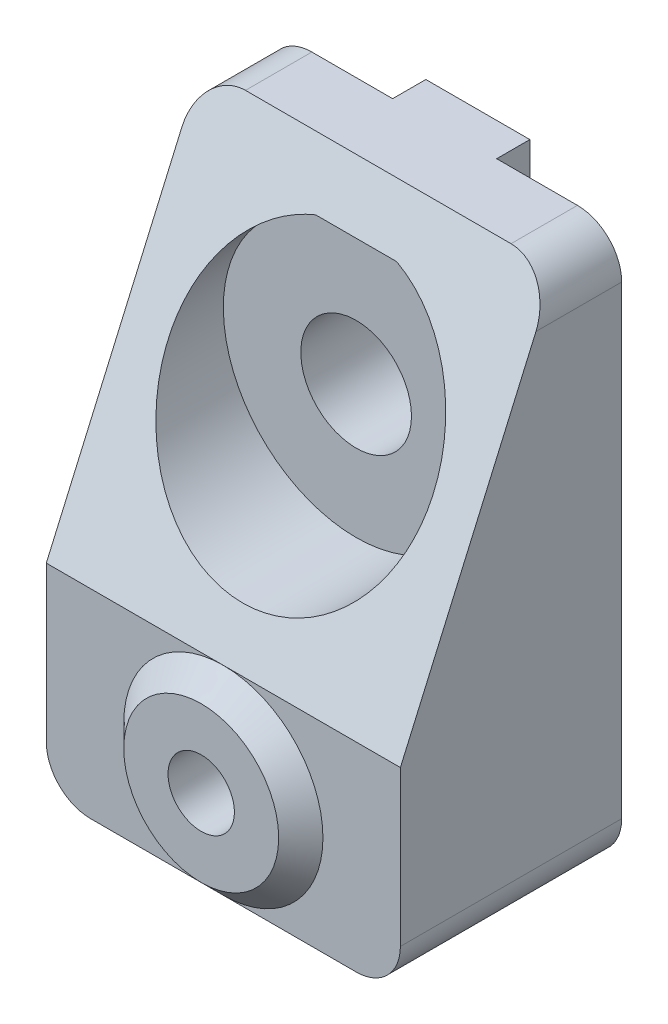
ISO-10303-21;
HEADER;
FILE_DESCRIPTION(('STEP AP214'),'2;1');
FILE_NAME('part.step','',(''),(''),'','','');
FILE_SCHEMA(('AUTOMOTIVE_DESIGN { 1 0 10303 214 1 1 1 1 }'));
ENDSEC;
DATA;
#1=APPLICATION_CONTEXT('core data for automotive mechanical design processes');
#2=APPLICATION_PROTOCOL_DEFINITION('international standard','automotive_design',2000,#1);
#3=PRODUCT_CONTEXT('',#1,'mechanical');
#4=PRODUCT('Part','Part','',(#3));
#5=PRODUCT_RELATED_PRODUCT_CATEGORY('part','',(#4));
#6=PRODUCT_DEFINITION_FORMATION('','',#4);
#7=PRODUCT_DEFINITION_CONTEXT('part definition',#1,'design');
#8=PRODUCT_DEFINITION('design','',#6,#7);
#9=PRODUCT_DEFINITION_SHAPE('','',#8);
#10=(LENGTH_UNIT() NAMED_UNIT(*) SI_UNIT(.MILLI.,.METRE.));
#11=(NAMED_UNIT(*) PLANE_ANGLE_UNIT() SI_UNIT($,.RADIAN.));
#12=(NAMED_UNIT(*) SI_UNIT($,.STERADIAN.) SOLID_ANGLE_UNIT());
#13=UNCERTAINTY_MEASURE_WITH_UNIT(LENGTH_MEASURE(1.E-05),#10,'distance_accuracy_value','');
#14=(GEOMETRIC_REPRESENTATION_CONTEXT(3) GLOBAL_UNCERTAINTY_ASSIGNED_CONTEXT((#13)) GLOBAL_UNIT_ASSIGNED_CONTEXT((#10,
#11,#12)) REPRESENTATION_CONTEXT('',''));
#15=CARTESIAN_POINT('',(0.,0.,0.));
#16=DIRECTION('',(0.,0.,1.));
#17=DIRECTION('',(1.,0.,0.));
#18=AXIS2_PLACEMENT_3D('',#15,#16,#17);
#19=CARTESIAN_POINT('',(-8.,-17.,10.));
#20=DIRECTION('',(0.,0.,1.));
#21=DIRECTION('',(1.,0.,0.));
#22=AXIS2_PLACEMENT_3D('',#19,#20,#21);
#23=PLANE('',#22);
#24=DIRECTION('',(-1.,0.,0.));
#25=VECTOR('',#24,1.);
#26=CARTESIAN_POINT('',(8.00000000000001,-8.,10.));
#27=LINE('',#26,#25);
#28=CARTESIAN_POINT('',(0.,-8.,10.));
#29=VERTEX_POINT('',#28);
#30=CARTESIAN_POINT('',(-8.,-8.,10.));
#31=VERTEX_POINT('',#30);
#32=EDGE_CURVE('E190',#29,#31,#27,.T.);
#33=ORIENTED_EDGE('',*,*,#32,.T.);
#34=DIRECTION('',(0.,1.,0.));
#35=VECTOR('',#34,1.);
#36=CARTESIAN_POINT('',(-8.,-17.,10.));
#37=LINE('',#36,#35);
#38=CARTESIAN_POINT('',(-8.,-15.,10.));
#39=VERTEX_POINT('',#38);
#40=EDGE_CURVE('E214',#39,#31,#37,.T.);
#41=ORIENTED_EDGE('',*,*,#40,.F.);
#42=CARTESIAN_POINT('',(-6.,-15.,10.));
#43=DIRECTION('',(0.,0.,1.));
#44=DIRECTION('',(1.,0.,0.));
#45=AXIS2_PLACEMENT_3D('',#42,#43,#44);
#46=CIRCLE('',#45,2.);
#47=CARTESIAN_POINT('',(-6.,-17.,10.));
#48=VERTEX_POINT('',#47);
#49=EDGE_CURVE('E249',#39,#48,#46,.T.);
#50=ORIENTED_EDGE('',*,*,#49,.T.);
#51=DIRECTION('',(1.,0.,0.));
#52=VECTOR('',#51,1.);
#53=CARTESIAN_POINT('',(-8.,-17.,10.));
#54=LINE('',#53,#52);
#55=CARTESIAN_POINT('',(0.,-17.,10.));
#56=VERTEX_POINT('',#55);
#57=EDGE_CURVE('E282',#48,#56,#54,.T.);
#58=ORIENTED_EDGE('',*,*,#57,.T.);
#59=CARTESIAN_POINT('',(0.,-12.5,10.));
#60=DIRECTION('',(0.,0.,1.));
#61=DIRECTION('',(1.,0.,0.));
#62=AXIS2_PLACEMENT_3D('',#59,#60,#61);
#63=CIRCLE('',#62,4.5);
#64=EDGE_CURVE('E370',#29,#56,#63,.T.);
#65=ORIENTED_EDGE('',*,*,#64,.F.);
#66=EDGE_LOOP('',(#33,#41,#50,#58,#65));
#67=FACE_BOUND('',#66,.T.);
#68=ADVANCED_FACE('F32',(#67),#23,.T.);
#69=CARTESIAN_POINT('',(8.00000000000001,-8.,10.));
#70=VERTEX_POINT('',#69);
#71=EDGE_CURVE('E184',#70,#29,#27,.T.);
#72=ORIENTED_EDGE('',*,*,#71,.T.);
#73=EDGE_CURVE('E373',#56,#29,#63,.T.);
#74=ORIENTED_EDGE('',*,*,#73,.F.);
#75=CARTESIAN_POINT('',(6.,-17.,10.));
#76=VERTEX_POINT('',#75);
#77=EDGE_CURVE('E287',#56,#76,#54,.T.);
#78=ORIENTED_EDGE('',*,*,#77,.T.);
#79=CARTESIAN_POINT('',(6.,-15.,10.));
#80=DIRECTION('',(0.,0.,1.));
#81=DIRECTION('',(1.,0.,0.));
#82=AXIS2_PLACEMENT_3D('',#79,#80,#81);
#83=CIRCLE('',#82,2.);
#84=CARTESIAN_POINT('',(8.,-15.,10.));
#85=VERTEX_POINT('',#84);
#86=EDGE_CURVE('E212',#76,#85,#83,.T.);
#87=ORIENTED_EDGE('',*,*,#86,.T.);
#88=DIRECTION('',(0.,1.,0.));
#89=VECTOR('',#88,1.);
#90=CARTESIAN_POINT('',(8.,-17.,10.));
#91=LINE('',#90,#89);
#92=EDGE_CURVE('E202',#85,#70,#91,.T.);
#93=ORIENTED_EDGE('',*,*,#92,.T.);
#94=EDGE_LOOP('',(#72,#74,#78,#87,#93));
#95=FACE_BOUND('',#94,.T.);
#96=ADVANCED_FACE('F209',(#95),#23,.T.);
#97=CARTESIAN_POINT('',(0.,0.,-1.5));
#98=DIRECTION('',(0.,0.,1.));
#99=DIRECTION('',(1.,0.,0.));
#100=AXIS2_PLACEMENT_3D('',#97,#98,#99);
#101=CYLINDRICAL_SURFACE('',#100,2.5);
#102=CARTESIAN_POINT('',(0.,0.,0.));
#103=DIRECTION('',(0.,0.,-1.));
#104=DIRECTION('',(-1.,0.,0.));
#105=AXIS2_PLACEMENT_3D('',#102,#103,#104);
#106=CIRCLE('',#105,2.5);
#107=CARTESIAN_POINT('',(-1.5,-2.,0.));
#108=VERTEX_POINT('',#107);
#109=CARTESIAN_POINT('',(-1.5,2.,0.));
#110=VERTEX_POINT('',#109);
#111=EDGE_CURVE('E229',#108,#110,#106,.T.);
#112=ORIENTED_EDGE('',*,*,#111,.T.);
#113=DIRECTION('',(0.,0.,1.));
#114=VECTOR('',#113,1.);
#115=CARTESIAN_POINT('',(-1.5,2.,-1.5));
#116=LINE('',#115,#114);
#117=CARTESIAN_POINT('',(-1.5,2.,-1.5));
#118=VERTEX_POINT('',#117);
#119=EDGE_CURVE('E408',#110,#118,#116,.F.);
#120=ORIENTED_EDGE('',*,*,#119,.T.);
#121=CARTESIAN_POINT('',(0.,0.,-1.5));
#122=DIRECTION('',(0.,0.,1.));
#123=DIRECTION('',(1.,0.,0.));
#124=AXIS2_PLACEMENT_3D('',#121,#122,#123);
#125=CIRCLE('',#124,2.5);
#126=CARTESIAN_POINT('',(1.5,2.,-1.5));
#127=VERTEX_POINT('',#126);
#128=EDGE_CURVE('E413',#127,#118,#125,.T.);
#129=ORIENTED_EDGE('',*,*,#128,.F.);
#130=DIRECTION('',(0.,0.,1.));
#131=VECTOR('',#130,1.);
#132=CARTESIAN_POINT('',(1.5,2.,-1.5));
#133=LINE('',#132,#131);
#134=CARTESIAN_POINT('',(1.5,2.,0.));
#135=VERTEX_POINT('',#134);
#136=EDGE_CURVE('E405',#127,#135,#133,.T.);
#137=ORIENTED_EDGE('',*,*,#136,.T.);
#138=CARTESIAN_POINT('',(0.,0.,0.));
#139=DIRECTION('',(0.,0.,-1.));
#140=DIRECTION('',(-1.,0.,0.));
#141=AXIS2_PLACEMENT_3D('',#138,#139,#140);
#142=CIRCLE('',#141,2.5);
#143=CARTESIAN_POINT('',(1.5,-2.,0.));
#144=VERTEX_POINT('',#143);
#145=EDGE_CURVE('E416',#135,#144,#142,.T.);
#146=ORIENTED_EDGE('',*,*,#145,.T.);
#147=DIRECTION('',(0.,0.,1.));
#148=VECTOR('',#147,1.);
#149=CARTESIAN_POINT('',(1.5,-2.,-1.5));
#150=LINE('',#149,#148);
#151=CARTESIAN_POINT('',(1.5,-2.,-1.5));
#152=VERTEX_POINT('',#151);
#153=EDGE_CURVE('E400',#144,#152,#150,.F.);
#154=ORIENTED_EDGE('',*,*,#153,.T.);
#155=CARTESIAN_POINT('',(-1.5,-2.,-1.5));
#156=VERTEX_POINT('',#155);
#157=EDGE_CURVE('E236',#156,#152,#125,.T.);
#158=ORIENTED_EDGE('',*,*,#157,.F.);
#159=DIRECTION('',(0.,0.,1.));
#160=VECTOR('',#159,1.);
#161=CARTESIAN_POINT('',(-1.5,-2.,-1.5));
#162=LINE('',#161,#160);
#163=EDGE_CURVE('E397',#156,#108,#162,.T.);
#164=ORIENTED_EDGE('',*,*,#163,.T.);
#165=EDGE_LOOP('',(#112,#120,#129,#137,#146,#154,#158,#164));
#166=FACE_BOUND('',#165,.T.);
#167=CARTESIAN_POINT('',(0.,0.,4.));
#168=DIRECTION('',(0.,0.,1.));
#169=DIRECTION('',(1.,0.,0.));
#170=AXIS2_PLACEMENT_3D('',#167,#168,#169);
#171=CIRCLE('',#170,2.5);
#172=CARTESIAN_POINT('',(2.5,0.,4.));
#173=VERTEX_POINT('',#172);
#174=EDGE_CURVE('E233',#173,#173,#171,.F.);
#175=ORIENTED_EDGE('',*,*,#174,.F.);
#176=EDGE_LOOP('',(#175));
#177=FACE_BOUND('',#176,.T.);
#178=ADVANCED_FACE('F452',(#166,#177),#101,.F.);
#179=CARTESIAN_POINT('',(-2.35,-17.,-1.5));
#180=DIRECTION('',(-1.,0.,0.));
#181=DIRECTION('',(0.,0.,1.));
#182=AXIS2_PLACEMENT_3D('',#179,#180,#181);
#183=PLANE('',#182);
#184=DIRECTION('',(0.,0.,1.));
#185=VECTOR('',#184,1.);
#186=CARTESIAN_POINT('',(-2.35,-2.,-1.5));
#187=LINE('',#186,#185);
#188=CARTESIAN_POINT('',(-2.35,-2.,-1.5));
#189=VERTEX_POINT('',#188);
#190=CARTESIAN_POINT('',(-2.35,-2.,0.));
#191=VERTEX_POINT('',#190);
#192=EDGE_CURVE('E379',#189,#191,#187,.T.);
#193=ORIENTED_EDGE('',*,*,#192,.F.);
#194=DIRECTION('',(0.,1.,0.));
#195=VECTOR('',#194,1.);
#196=CARTESIAN_POINT('',(-2.35,-17.,-1.5));
#197=LINE('',#196,#195);
#198=CARTESIAN_POINT('',(-2.35,-17.,-1.5));
#199=VERTEX_POINT('',#198);
#200=EDGE_CURVE('E232',#199,#189,#197,.T.);
#201=ORIENTED_EDGE('',*,*,#200,.F.);
#202=DIRECTION('',(0.,0.,1.));
#203=VECTOR('',#202,1.);
#204=CARTESIAN_POINT('',(-2.35,-17.,-1.5));
#205=LINE('',#204,#203);
#206=CARTESIAN_POINT('',(-2.35,-17.,0.));
#207=VERTEX_POINT('',#206);
#208=EDGE_CURVE('E331',#199,#207,#205,.T.);
#209=ORIENTED_EDGE('',*,*,#208,.T.);
#210=DIRECTION('',(0.,1.,0.));
#211=VECTOR('',#210,1.);
#212=CARTESIAN_POINT('',(-2.35,-17.,0.));
#213=LINE('',#212,#211);
#214=EDGE_CURVE('E225',#207,#191,#213,.T.);
#215=ORIENTED_EDGE('',*,*,#214,.T.);
#216=EDGE_LOOP('',(#193,#201,#209,#215));
#217=FACE_BOUND('',#216,.T.);
#218=ADVANCED_FACE('F340',(#217),#183,.T.);
#219=CARTESIAN_POINT('',(-2.35,-17.,-1.5));
#220=DIRECTION('',(0.,0.,-1.));
#221=DIRECTION('',(-1.,0.,0.));
#222=AXIS2_PLACEMENT_3D('',#219,#220,#221);
#223=PLANE('',#222);
#224=DIRECTION('',(-1.,0.,0.));
#225=VECTOR('',#224,1.);
#226=CARTESIAN_POINT('',(8.,2.,-1.5));
#227=LINE('',#226,#225);
#228=CARTESIAN_POINT('',(-2.35,2.,-1.5));
#229=VERTEX_POINT('',#228);
#230=EDGE_CURVE('E384',#118,#229,#227,.T.);
#231=ORIENTED_EDGE('',*,*,#230,.T.);
#232=CARTESIAN_POINT('',(-2.35,8.,-1.5));
#233=VERTEX_POINT('',#232);
#234=EDGE_CURVE('E302',#229,#233,#197,.T.);
#235=ORIENTED_EDGE('',*,*,#234,.T.);
#236=DIRECTION('',(-1.,0.,0.));
#237=VECTOR('',#236,1.);
#238=CARTESIAN_POINT('',(-2.35,8.,-1.5));
#239=LINE('',#238,#237);
#240=CARTESIAN_POINT('',(2.35,8.,-1.5));
#241=VERTEX_POINT('',#240);
#242=EDGE_CURVE('E329',#241,#233,#239,.T.);
#243=ORIENTED_EDGE('',*,*,#242,.F.);
#244=DIRECTION('',(0.,1.,0.));
#245=VECTOR('',#244,1.);
#246=CARTESIAN_POINT('',(2.35,-17.,-1.5));
#247=LINE('',#246,#245);
#248=CARTESIAN_POINT('',(2.35,2.,-1.5));
#249=VERTEX_POINT('',#248);
#250=EDGE_CURVE('E305',#249,#241,#247,.T.);
#251=ORIENTED_EDGE('',*,*,#250,.F.);
#252=EDGE_CURVE('E387',#249,#127,#227,.T.);
#253=ORIENTED_EDGE('',*,*,#252,.T.);
#254=ORIENTED_EDGE('',*,*,#128,.T.);
#255=EDGE_LOOP('',(#231,#235,#243,#251,#253,#254));
#256=FACE_BOUND('',#255,.T.);
#257=ADVANCED_FACE('F489',(#256),#223,.T.);
#258=CARTESIAN_POINT('',(2.35,-17.,-1.5));
#259=DIRECTION('',(1.,0.,0.));
#260=DIRECTION('',(0.,0.,-1.));
#261=AXIS2_PLACEMENT_3D('',#258,#259,#260);
#262=PLANE('',#261);
#263=DIRECTION('',(0.,0.,1.));
#264=VECTOR('',#263,1.);
#265=CARTESIAN_POINT('',(2.35,2.,-1.5));
#266=LINE('',#265,#264);
#267=CARTESIAN_POINT('',(2.35,2.,0.));
#268=VERTEX_POINT('',#267);
#269=EDGE_CURVE('E403',#249,#268,#266,.T.);
#270=ORIENTED_EDGE('',*,*,#269,.F.);
#271=ORIENTED_EDGE('',*,*,#250,.T.);
#272=DIRECTION('',(0.,0.,-1.));
#273=VECTOR('',#272,1.);
#274=CARTESIAN_POINT('',(2.35,8.,-1.5));
#275=LINE('',#274,#273);
#276=CARTESIAN_POINT('',(2.35,8.,0.));
#277=VERTEX_POINT('',#276);
#278=EDGE_CURVE('E323',#277,#241,#275,.T.);
#279=ORIENTED_EDGE('',*,*,#278,.F.);
#280=DIRECTION('',(0.,1.,0.));
#281=VECTOR('',#280,1.);
#282=CARTESIAN_POINT('',(2.35,-17.,0.));
#283=LINE('',#282,#281);
#284=EDGE_CURVE('E216',#268,#277,#283,.T.);
#285=ORIENTED_EDGE('',*,*,#284,.F.);
#286=EDGE_LOOP('',(#270,#271,#279,#285));
#287=FACE_BOUND('',#286,.T.);
#288=ADVANCED_FACE('F324',(#287),#262,.T.);
#289=DIRECTION('',(0.,0.,-1.));
#290=VECTOR('',#289,1.);
#291=CARTESIAN_POINT('',(-2.35,2.,-1.5));
#292=LINE('',#291,#290);
#293=CARTESIAN_POINT('',(-2.35,2.,0.));
#294=VERTEX_POINT('',#293);
#295=EDGE_CURVE('E381',#294,#229,#292,.T.);
#296=ORIENTED_EDGE('',*,*,#295,.F.);
#297=CARTESIAN_POINT('',(-2.35,8.,0.));
#298=VERTEX_POINT('',#297);
#299=EDGE_CURVE('E228',#294,#298,#213,.T.);
#300=ORIENTED_EDGE('',*,*,#299,.T.);
#301=DIRECTION('',(0.,0.,1.));
#302=VECTOR('',#301,1.);
#303=CARTESIAN_POINT('',(-2.35,8.,-1.5));
#304=LINE('',#303,#302);
#305=EDGE_CURVE('E418',#233,#298,#304,.T.);
#306=ORIENTED_EDGE('',*,*,#305,.F.);
#307=ORIENTED_EDGE('',*,*,#234,.F.);
#308=EDGE_LOOP('',(#296,#300,#306,#307));
#309=FACE_BOUND('',#308,.T.);
#310=ADVANCED_FACE('F460',(#309),#183,.T.);
#311=CARTESIAN_POINT('',(0.,-12.5,-1.5));
#312=DIRECTION('',(0.,0.,1.));
#313=DIRECTION('',(1.,0.,0.));
#314=AXIS2_PLACEMENT_3D('',#311,#312,#313);
#315=CIRCLE('',#314,1.5);
#316=CARTESIAN_POINT('',(1.5,-12.5,-1.5));
#317=VERTEX_POINT('',#316);
#318=EDGE_CURVE('E367',#317,#317,#315,.T.);
#319=ORIENTED_EDGE('',*,*,#318,.T.);
#320=EDGE_LOOP('',(#319));
#321=FACE_BOUND('',#320,.T.);
#322=DIRECTION('',(-1.,0.,0.));
#323=VECTOR('',#322,1.);
#324=CARTESIAN_POINT('',(8.,-2.,-1.5));
#325=LINE('',#324,#323);
#326=CARTESIAN_POINT('',(2.35,-2.,-1.5));
#327=VERTEX_POINT('',#326);
#328=EDGE_CURVE('E348',#327,#152,#325,.T.);
#329=ORIENTED_EDGE('',*,*,#328,.F.);
#330=CARTESIAN_POINT('',(2.35,-17.,-1.5));
#331=VERTEX_POINT('',#330);
#332=EDGE_CURVE('E303',#331,#327,#247,.T.);
#333=ORIENTED_EDGE('',*,*,#332,.F.);
#334=DIRECTION('',(-1.,0.,0.));
#335=VECTOR('',#334,1.);
#336=CARTESIAN_POINT('',(-2.35,-17.,-1.5));
#337=LINE('',#336,#335);
#338=EDGE_CURVE('E297',#331,#199,#337,.T.);
#339=ORIENTED_EDGE('',*,*,#338,.T.);
#340=ORIENTED_EDGE('',*,*,#200,.T.);
#341=EDGE_CURVE('E383',#156,#189,#325,.T.);
#342=ORIENTED_EDGE('',*,*,#341,.F.);
#343=ORIENTED_EDGE('',*,*,#157,.T.);
#344=EDGE_LOOP('',(#329,#333,#339,#340,#342,#343));
#345=FACE_BOUND('',#344,.T.);
#346=ADVANCED_FACE('F345',(#321,#345),#223,.T.);
#347=DIRECTION('',(0.,0.,-1.));
#348=VECTOR('',#347,1.);
#349=CARTESIAN_POINT('',(2.35,-2.,-1.5));
#350=LINE('',#349,#348);
#351=CARTESIAN_POINT('',(2.35,-2.,0.));
#352=VERTEX_POINT('',#351);
#353=EDGE_CURVE('E395',#352,#327,#350,.T.);
#354=ORIENTED_EDGE('',*,*,#353,.F.);
#355=CARTESIAN_POINT('',(2.35,-17.,0.));
#356=VERTEX_POINT('',#355);
#357=EDGE_CURVE('E306',#356,#352,#283,.T.);
#358=ORIENTED_EDGE('',*,*,#357,.F.);
#359=DIRECTION('',(0.,0.,-1.));
#360=VECTOR('',#359,1.);
#361=CARTESIAN_POINT('',(2.35,-17.,-1.5));
#362=LINE('',#361,#360);
#363=EDGE_CURVE('E290',#356,#331,#362,.T.);
#364=ORIENTED_EDGE('',*,*,#363,.T.);
#365=ORIENTED_EDGE('',*,*,#332,.T.);
#366=EDGE_LOOP('',(#354,#358,#364,#365));
#367=FACE_BOUND('',#366,.T.);
#368=ADVANCED_FACE('F351',(#367),#262,.T.);
#369=CARTESIAN_POINT('',(2.35,-17.,0.));
#370=DIRECTION('',(0.,0.,-1.));
#371=DIRECTION('',(-1.,0.,0.));
#372=AXIS2_PLACEMENT_3D('',#369,#370,#371);
#373=PLANE('',#372);
#374=DIRECTION('',(-1.,0.,0.));
#375=VECTOR('',#374,1.);
#376=CARTESIAN_POINT('',(2.35,8.,0.));
#377=LINE('',#376,#375);
#378=CARTESIAN_POINT('',(6.,8.,0.));
#379=VERTEX_POINT('',#378);
#380=EDGE_CURVE('E316',#379,#277,#377,.T.);
#381=ORIENTED_EDGE('',*,*,#380,.F.);
#382=CARTESIAN_POINT('',(6.,6.,0.));
#383=DIRECTION('',(0.,0.,-1.));
#384=DIRECTION('',(-1.,0.,0.));
#385=AXIS2_PLACEMENT_3D('',#382,#383,#384);
#386=CIRCLE('',#385,2.);
#387=CARTESIAN_POINT('',(8.,6.,0.));
#388=VERTEX_POINT('',#387);
#389=EDGE_CURVE('E244',#379,#388,#386,.T.);
#390=ORIENTED_EDGE('',*,*,#389,.T.);
#391=DIRECTION('',(0.,1.,0.));
#392=VECTOR('',#391,1.);
#393=CARTESIAN_POINT('',(8.,-17.,0.));
#394=LINE('',#393,#392);
#395=CARTESIAN_POINT('',(8.,-15.,0.));
#396=VERTEX_POINT('',#395);
#397=EDGE_CURVE('E213',#396,#388,#394,.T.);
#398=ORIENTED_EDGE('',*,*,#397,.F.);
#399=CARTESIAN_POINT('',(6.,-15.,0.));
#400=DIRECTION('',(0.,0.,-1.));
#401=DIRECTION('',(-1.,0.,0.));
#402=AXIS2_PLACEMENT_3D('',#399,#400,#401);
#403=CIRCLE('',#402,2.);
#404=CARTESIAN_POINT('',(6.,-17.,0.));
#405=VERTEX_POINT('',#404);
#406=EDGE_CURVE('E242',#396,#405,#403,.T.);
#407=ORIENTED_EDGE('',*,*,#406,.T.);
#408=DIRECTION('',(-1.,0.,0.));
#409=VECTOR('',#408,1.);
#410=CARTESIAN_POINT('',(2.35,-17.,0.));
#411=LINE('',#410,#409);
#412=EDGE_CURVE('E288',#405,#356,#411,.T.);
#413=ORIENTED_EDGE('',*,*,#412,.T.);
#414=ORIENTED_EDGE('',*,*,#357,.T.);
#415=DIRECTION('',(-1.,0.,0.));
#416=VECTOR('',#415,1.);
#417=CARTESIAN_POINT('',(8.,-2.,0.));
#418=LINE('',#417,#416);
#419=EDGE_CURVE('E390',#352,#144,#418,.T.);
#420=ORIENTED_EDGE('',*,*,#419,.T.);
#421=ORIENTED_EDGE('',*,*,#145,.F.);
#422=DIRECTION('',(-1.,0.,0.));
#423=VECTOR('',#422,1.);
#424=CARTESIAN_POINT('',(8.,2.,0.));
#425=LINE('',#424,#423);
#426=EDGE_CURVE('E318',#268,#135,#425,.T.);
#427=ORIENTED_EDGE('',*,*,#426,.F.);
#428=ORIENTED_EDGE('',*,*,#284,.T.);
#429=EDGE_LOOP('',(#381,#390,#398,#407,#413,#414,#420,#421,#427,#428));
#430=FACE_BOUND('',#429,.T.);
#431=ADVANCED_FACE('F315',(#430),#373,.T.);
#432=CARTESIAN_POINT('',(8.,-17.,10.));
#433=DIRECTION('',(1.,0.,0.));
#434=DIRECTION('',(0.,0.,-1.));
#435=AXIS2_PLACEMENT_3D('',#432,#433,#434);
#436=PLANE('',#435);
#437=DIRECTION('',(0.,-0.916157334902189,0.400818834019708));
#438=VECTOR('',#437,1.);
#439=CARTESIAN_POINT('',(8.,8.,3.));
#440=LINE('',#439,#438);
#441=CARTESIAN_POINT('',(8.,6.,3.875));
#442=VERTEX_POINT('',#441);
#443=EDGE_CURVE('E187',#442,#70,#440,.T.);
#444=ORIENTED_EDGE('',*,*,#443,.T.);
#445=ORIENTED_EDGE('',*,*,#92,.F.);
#446=DIRECTION('',(0.,0.,-1.));
#447=VECTOR('',#446,1.);
#448=CARTESIAN_POINT('',(8.,-15.,0.));
#449=LINE('',#448,#447);
#450=EDGE_CURVE('E246',#85,#396,#449,.T.);
#451=ORIENTED_EDGE('',*,*,#450,.T.);
#452=ORIENTED_EDGE('',*,*,#397,.T.);
#453=DIRECTION('',(0.,0.,-1.));
#454=VECTOR('',#453,1.);
#455=CARTESIAN_POINT('',(8.,6.,10.));
#456=LINE('',#455,#454);
#457=EDGE_CURVE('E206',#388,#442,#456,.F.);
#458=ORIENTED_EDGE('',*,*,#457,.T.);
#459=EDGE_LOOP('',(#444,#445,#451,#452,#458));
#460=FACE_BOUND('',#459,.T.);
#461=ADVANCED_FACE('F200',(#460),#436,.T.);
#462=CARTESIAN_POINT('',(-8.,-17.,0.));
#463=DIRECTION('',(-1.,0.,0.));
#464=DIRECTION('',(0.,0.,1.));
#465=AXIS2_PLACEMENT_3D('',#462,#463,#464);
#466=PLANE('',#465);
#467=DIRECTION('',(0.,-0.916157334902189,0.400818834019708));
#468=VECTOR('',#467,1.);
#469=CARTESIAN_POINT('',(-8.,8.,3.));
#470=LINE('',#469,#468);
#471=CARTESIAN_POINT('',(-8.,6.,3.875));
#472=VERTEX_POINT('',#471);
#473=EDGE_CURVE('E207',#472,#31,#470,.T.);
#474=ORIENTED_EDGE('',*,*,#473,.F.);
#475=DIRECTION('',(0.,0.,1.));
#476=VECTOR('',#475,1.);
#477=CARTESIAN_POINT('',(-8.,6.,0.));
#478=LINE('',#477,#476);
#479=CARTESIAN_POINT('',(-8.,6.,0.));
#480=VERTEX_POINT('',#479);
#481=EDGE_CURVE('E256',#472,#480,#478,.F.);
#482=ORIENTED_EDGE('',*,*,#481,.T.);
#483=DIRECTION('',(0.,1.,0.));
#484=VECTOR('',#483,1.);
#485=CARTESIAN_POINT('',(-8.,-17.,0.));
#486=LINE('',#485,#484);
#487=CARTESIAN_POINT('',(-8.,-15.,0.));
#488=VERTEX_POINT('',#487);
#489=EDGE_CURVE('E219',#488,#480,#486,.T.);
#490=ORIENTED_EDGE('',*,*,#489,.F.);
#491=DIRECTION('',(0.,0.,1.));
#492=VECTOR('',#491,1.);
#493=CARTESIAN_POINT('',(-8.,-15.,10.));
#494=LINE('',#493,#492);
#495=EDGE_CURVE('E258',#488,#39,#494,.T.);
#496=ORIENTED_EDGE('',*,*,#495,.T.);
#497=ORIENTED_EDGE('',*,*,#40,.T.);
#498=EDGE_LOOP('',(#474,#482,#490,#496,#497));
#499=FACE_BOUND('',#498,.T.);
#500=ADVANCED_FACE('F275',(#499),#466,.T.);
#501=CARTESIAN_POINT('',(-8.,-17.,0.));
#502=DIRECTION('',(0.,0.,-1.));
#503=DIRECTION('',(-1.,0.,0.));
#504=AXIS2_PLACEMENT_3D('',#501,#502,#503);
#505=PLANE('',#504);
#506=DIRECTION('',(-1.,0.,0.));
#507=VECTOR('',#506,1.);
#508=CARTESIAN_POINT('',(-8.,-17.,0.));
#509=LINE('',#508,#507);
#510=CARTESIAN_POINT('',(-6.,-17.,0.));
#511=VERTEX_POINT('',#510);
#512=EDGE_CURVE('E269',#207,#511,#509,.T.);
#513=ORIENTED_EDGE('',*,*,#512,.T.);
#514=CARTESIAN_POINT('',(-6.,-15.,0.));
#515=DIRECTION('',(0.,0.,-1.));
#516=DIRECTION('',(-1.,0.,0.));
#517=AXIS2_PLACEMENT_3D('',#514,#515,#516);
#518=CIRCLE('',#517,2.);
#519=EDGE_CURVE('E40',#511,#488,#518,.T.);
#520=ORIENTED_EDGE('',*,*,#519,.T.);
#521=ORIENTED_EDGE('',*,*,#489,.T.);
#522=CARTESIAN_POINT('',(-6.,6.,0.));
#523=DIRECTION('',(0.,0.,-1.));
#524=DIRECTION('',(-1.,0.,0.));
#525=AXIS2_PLACEMENT_3D('',#522,#523,#524);
#526=CIRCLE('',#525,2.);
#527=CARTESIAN_POINT('',(-6.,8.,0.));
#528=VERTEX_POINT('',#527);
#529=EDGE_CURVE('E261',#480,#528,#526,.T.);
#530=ORIENTED_EDGE('',*,*,#529,.T.);
#531=DIRECTION('',(-1.,0.,0.));
#532=VECTOR('',#531,1.);
#533=CARTESIAN_POINT('',(-8.,8.,0.));
#534=LINE('',#533,#532);
#535=EDGE_CURVE('E333',#298,#528,#534,.T.);
#536=ORIENTED_EDGE('',*,*,#535,.F.);
#537=ORIENTED_EDGE('',*,*,#299,.F.);
#538=EDGE_CURVE('E388',#110,#294,#425,.T.);
#539=ORIENTED_EDGE('',*,*,#538,.F.);
#540=ORIENTED_EDGE('',*,*,#111,.F.);
#541=EDGE_CURVE('E391',#108,#191,#418,.T.);
#542=ORIENTED_EDGE('',*,*,#541,.T.);
#543=ORIENTED_EDGE('',*,*,#214,.F.);
#544=EDGE_LOOP('',(#513,#520,#521,#530,#536,#537,#539,#540,#542,#543));
#545=FACE_BOUND('',#544,.T.);
#546=ADVANCED_FACE('F266',(#545),#505,.T.);
#547=CARTESIAN_POINT('',(0.,-17.,0.));
#548=DIRECTION('',(0.,1.,0.));
#549=DIRECTION('',(0.,0.,1.));
#550=AXIS2_PLACEMENT_3D('',#547,#548,#549);
#551=PLANE('',#550);
#552=ORIENTED_EDGE('',*,*,#412,.F.);
#553=DIRECTION('',(0.,0.,-1.));
#554=VECTOR('',#553,1.);
#555=CARTESIAN_POINT('',(6.,-17.,10.));
#556=LINE('',#555,#554);
#557=EDGE_CURVE('E254',#405,#76,#556,.F.);
#558=ORIENTED_EDGE('',*,*,#557,.T.);
#559=ORIENTED_EDGE('',*,*,#77,.F.);
#560=ORIENTED_EDGE('',*,*,#57,.F.);
#561=DIRECTION('',(0.,0.,1.));
#562=VECTOR('',#561,1.);
#563=CARTESIAN_POINT('',(-6.,-17.,0.));
#564=LINE('',#563,#562);
#565=EDGE_CURVE('E252',#48,#511,#564,.F.);
#566=ORIENTED_EDGE('',*,*,#565,.T.);
#567=ORIENTED_EDGE('',*,*,#512,.F.);
#568=ORIENTED_EDGE('',*,*,#208,.F.);
#569=ORIENTED_EDGE('',*,*,#338,.F.);
#570=ORIENTED_EDGE('',*,*,#363,.F.);
#571=EDGE_LOOP('',(#552,#558,#559,#560,#566,#567,#568,#569,#570));
#572=FACE_BOUND('',#571,.T.);
#573=ADVANCED_FACE('F286',(#572),#551,.F.);
#574=CARTESIAN_POINT('',(0.,8.,0.));
#575=DIRECTION('',(0.,1.,0.));
#576=DIRECTION('',(0.,0.,1.));
#577=AXIS2_PLACEMENT_3D('',#574,#575,#576);
#578=PLANE('',#577);
#579=DIRECTION('',(-1.,0.,0.));
#580=VECTOR('',#579,1.);
#581=CARTESIAN_POINT('',(8.,8.,3.));
#582=LINE('',#581,#580);
#583=CARTESIAN_POINT('',(6.,8.,3.));
#584=VERTEX_POINT('',#583);
#585=CARTESIAN_POINT('',(-6.,8.,3.));
#586=VERTEX_POINT('',#585);
#587=EDGE_CURVE('E53',#584,#586,#582,.T.);
#588=ORIENTED_EDGE('',*,*,#587,.F.);
#589=DIRECTION('',(0.,0.,-1.));
#590=VECTOR('',#589,1.);
#591=CARTESIAN_POINT('',(6.,8.,0.));
#592=LINE('',#591,#590);
#593=EDGE_CURVE('E240',#584,#379,#592,.T.);
#594=ORIENTED_EDGE('',*,*,#593,.T.);
#595=ORIENTED_EDGE('',*,*,#380,.T.);
#596=ORIENTED_EDGE('',*,*,#278,.T.);
#597=ORIENTED_EDGE('',*,*,#242,.T.);
#598=ORIENTED_EDGE('',*,*,#305,.T.);
#599=ORIENTED_EDGE('',*,*,#535,.T.);
#600=DIRECTION('',(0.,0.,1.));
#601=VECTOR('',#600,1.);
#602=CARTESIAN_POINT('',(-6.,8.,0.));
#603=LINE('',#602,#601);
#604=EDGE_CURVE('E231',#528,#586,#603,.T.);
#605=ORIENTED_EDGE('',*,*,#604,.T.);
#606=EDGE_LOOP('',(#588,#594,#595,#596,#597,#598,#599,#605));
#607=FACE_BOUND('',#606,.T.);
#608=ADVANCED_FACE('F423',(#607),#578,.T.);
#609=CARTESIAN_POINT('',(0.,0.,4.));
#610=DIRECTION('',(0.,0.,1.));
#611=DIRECTION('',(1.,0.,0.));
#612=AXIS2_PLACEMENT_3D('',#609,#610,#611);
#613=PLANE('',#612);
#614=DIRECTION('',(1.,0.,0.));
#615=VECTOR('',#614,1.);
#616=CARTESIAN_POINT('',(0.,5.71428571428572,4.));
#617=LINE('',#616,#615);
#618=CARTESIAN_POINT('',(-1.82946406783795,5.71428571428572,4.));
#619=VERTEX_POINT('',#618);
#620=CARTESIAN_POINT('',(1.82946406783796,5.71428571428572,4.));
#621=VERTEX_POINT('',#620);
#622=EDGE_CURVE('E46',#619,#621,#617,.T.);
#623=ORIENTED_EDGE('',*,*,#622,.F.);
#624=CARTESIAN_POINT('',(0.,0.,4.));
#625=DIRECTION('',(0.,0.,1.));
#626=DIRECTION('',(1.,0.,0.));
#627=AXIS2_PLACEMENT_3D('',#624,#625,#626);
#628=CIRCLE('',#627,6.);
#629=EDGE_CURVE('E237',#619,#621,#628,.T.);
#630=ORIENTED_EDGE('',*,*,#629,.T.);
#631=EDGE_LOOP('',(#623,#630));
#632=FACE_BOUND('',#631,.T.);
#633=ORIENTED_EDGE('',*,*,#174,.T.);
#634=EDGE_LOOP('',(#633));
#635=FACE_BOUND('',#634,.T.);
#636=ADVANCED_FACE('F523',(#632,#635),#613,.T.);
#637=CARTESIAN_POINT('',(0.,0.,10.));
#638=DIRECTION('',(0.,0.,-1.));
#639=DIRECTION('',(-1.,0.,0.));
#640=AXIS2_PLACEMENT_3D('',#637,#638,#639);
#641=CYLINDRICAL_SURFACE('',#640,6.);
#642=CARTESIAN_POINT('',(0.,0.,6.5));
#643=DIRECTION('',(0.,-0.400818834019708,-0.916157334902189));
#644=DIRECTION('',(0.,0.916157334902189,-0.400818834019708));
#645=AXIS2_PLACEMENT_3D('',#642,#643,#644);
#646=ELLIPSE('',#645,6.54909344871487,6.);
#647=EDGE_CURVE('E360',#621,#619,#646,.T.);
#648=ORIENTED_EDGE('',*,*,#647,.F.);
#649=ORIENTED_EDGE('',*,*,#629,.F.);
#650=EDGE_LOOP('',(#648,#649));
#651=FACE_BOUND('',#650,.T.);
#652=ADVANCED_FACE('F521',(#651),#641,.F.);
#653=CARTESIAN_POINT('',(8.,2.,-1.5));
#654=DIRECTION('',(0.,1.,0.));
#655=DIRECTION('',(0.,0.,1.));
#656=AXIS2_PLACEMENT_3D('',#653,#654,#655);
#657=PLANE('',#656);
#658=ORIENTED_EDGE('',*,*,#538,.T.);
#659=ORIENTED_EDGE('',*,*,#295,.T.);
#660=ORIENTED_EDGE('',*,*,#230,.F.);
#661=ORIENTED_EDGE('',*,*,#119,.F.);
#662=EDGE_LOOP('',(#658,#659,#660,#661));
#663=FACE_BOUND('',#662,.T.);
#664=ADVANCED_FACE('F445',(#663),#657,.F.);
#665=CARTESIAN_POINT('',(8.,-2.,-1.5));
#666=DIRECTION('',(0.,-1.,0.));
#667=DIRECTION('',(0.,0.,-1.));
#668=AXIS2_PLACEMENT_3D('',#665,#666,#667);
#669=PLANE('',#668);
#670=ORIENTED_EDGE('',*,*,#341,.T.);
#671=ORIENTED_EDGE('',*,*,#192,.T.);
#672=ORIENTED_EDGE('',*,*,#541,.F.);
#673=ORIENTED_EDGE('',*,*,#163,.F.);
#674=EDGE_LOOP('',(#670,#671,#672,#673));
#675=FACE_BOUND('',#674,.T.);
#676=ADVANCED_FACE('F513',(#675),#669,.F.);
#677=ORIENTED_EDGE('',*,*,#419,.F.);
#678=ORIENTED_EDGE('',*,*,#353,.T.);
#679=ORIENTED_EDGE('',*,*,#328,.T.);
#680=ORIENTED_EDGE('',*,*,#153,.F.);
#681=EDGE_LOOP('',(#677,#678,#679,#680));
#682=FACE_BOUND('',#681,.T.);
#683=ADVANCED_FACE('F442',(#682),#669,.F.);
#684=ORIENTED_EDGE('',*,*,#252,.F.);
#685=ORIENTED_EDGE('',*,*,#269,.T.);
#686=ORIENTED_EDGE('',*,*,#426,.T.);
#687=ORIENTED_EDGE('',*,*,#136,.F.);
#688=EDGE_LOOP('',(#684,#685,#686,#687));
#689=FACE_BOUND('',#688,.T.);
#690=ADVANCED_FACE('F432',(#689),#657,.F.);
#691=CARTESIAN_POINT('',(0.,-12.5,10.));
#692=DIRECTION('',(0.,0.,-1.));
#693=DIRECTION('',(1.,0.,0.));
#694=AXIS2_PLACEMENT_3D('',#691,#692,#693);
#695=CONICAL_SURFACE('',#694,4.5,0.78539816339745);
#696=CARTESIAN_POINT('',(0.,-12.5,11.));
#697=DIRECTION('',(0.,0.,1.));
#698=DIRECTION('',(1.,0.,0.));
#699=AXIS2_PLACEMENT_3D('',#696,#697,#698);
#700=CIRCLE('',#699,3.5);
#701=CARTESIAN_POINT('',(3.5,-12.5,11.));
#702=VERTEX_POINT('',#701);
#703=EDGE_CURVE('E376',#702,#702,#700,.T.);
#704=ORIENTED_EDGE('',*,*,#703,.F.);
#705=EDGE_LOOP('',(#704));
#706=FACE_BOUND('',#705,.T.);
#707=ORIENTED_EDGE('',*,*,#73,.T.);
#708=ORIENTED_EDGE('',*,*,#64,.T.);
#709=EDGE_LOOP('',(#707,#708));
#710=FACE_BOUND('',#709,.T.);
#711=ADVANCED_FACE('F429',(#706,#710),#695,.T.);
#712=CARTESIAN_POINT('',(0.,-12.5,11.));
#713=DIRECTION('',(0.,0.,1.));
#714=DIRECTION('',(1.,0.,0.));
#715=AXIS2_PLACEMENT_3D('',#712,#713,#714);
#716=PLANE('',#715);
#717=CARTESIAN_POINT('',(0.,-12.5,11.));
#718=DIRECTION('',(0.,0.,1.));
#719=DIRECTION('',(1.,0.,0.));
#720=AXIS2_PLACEMENT_3D('',#717,#718,#719);
#721=CIRCLE('',#720,1.5);
#722=CARTESIAN_POINT('',(1.5,-12.5,11.));
#723=VERTEX_POINT('',#722);
#724=EDGE_CURVE('E366',#723,#723,#721,.T.);
#725=ORIENTED_EDGE('',*,*,#724,.F.);
#726=EDGE_LOOP('',(#725));
#727=FACE_BOUND('',#726,.T.);
#728=ORIENTED_EDGE('',*,*,#703,.T.);
#729=EDGE_LOOP('',(#728));
#730=FACE_BOUND('',#729,.T.);
#731=ADVANCED_FACE('F431',(#727,#730),#716,.T.);
#732=CARTESIAN_POINT('',(0.,-12.5,-1.5));
#733=DIRECTION('',(0.,0.,1.));
#734=DIRECTION('',(1.,0.,0.));
#735=AXIS2_PLACEMENT_3D('',#732,#733,#734);
#736=CYLINDRICAL_SURFACE('',#735,1.5);
#737=ORIENTED_EDGE('',*,*,#318,.F.);
#738=EDGE_LOOP('',(#737));
#739=FACE_BOUND('',#738,.T.);
#740=ORIENTED_EDGE('',*,*,#724,.T.);
#741=EDGE_LOOP('',(#740));
#742=FACE_BOUND('',#741,.T.);
#743=ADVANCED_FACE('F439',(#739,#742),#736,.F.);
#744=CARTESIAN_POINT('',(6.,6.,0.));
#745=DIRECTION('',(0.,0.,-1.));
#746=DIRECTION('',(-1.,0.,0.));
#747=AXIS2_PLACEMENT_3D('',#744,#745,#746);
#748=CYLINDRICAL_SURFACE('',#747,2.);
#749=CARTESIAN_POINT('',(6.,6.,3.875));
#750=DIRECTION('',(0.,-0.400818834019708,-0.916157334902189));
#751=DIRECTION('',(0.,0.916157334902189,-0.400818834019708));
#752=AXIS2_PLACEMENT_3D('',#749,#750,#751);
#753=ELLIPSE('',#752,2.18303114957162,2.);
#754=EDGE_CURVE('E195',#442,#584,#753,.F.);
#755=ORIENTED_EDGE('',*,*,#754,.F.);
#756=ORIENTED_EDGE('',*,*,#457,.F.);
#757=ORIENTED_EDGE('',*,*,#389,.F.);
#758=ORIENTED_EDGE('',*,*,#593,.F.);
#759=EDGE_LOOP('',(#755,#756,#757,#758));
#760=FACE_BOUND('',#759,.T.);
#761=ADVANCED_FACE('F359',(#760),#748,.T.);
#762=CARTESIAN_POINT('',(6.,-15.,10.));
#763=DIRECTION('',(0.,0.,1.));
#764=DIRECTION('',(1.,0.,0.));
#765=AXIS2_PLACEMENT_3D('',#762,#763,#764);
#766=CYLINDRICAL_SURFACE('',#765,2.);
#767=ORIENTED_EDGE('',*,*,#86,.F.);
#768=ORIENTED_EDGE('',*,*,#557,.F.);
#769=ORIENTED_EDGE('',*,*,#406,.F.);
#770=ORIENTED_EDGE('',*,*,#450,.F.);
#771=EDGE_LOOP('',(#767,#768,#769,#770));
#772=FACE_BOUND('',#771,.T.);
#773=ADVANCED_FACE('F354',(#772),#766,.T.);
#774=CARTESIAN_POINT('',(-6.,-15.,0.));
#775=DIRECTION('',(0.,0.,-1.));
#776=DIRECTION('',(-1.,0.,0.));
#777=AXIS2_PLACEMENT_3D('',#774,#775,#776);
#778=CYLINDRICAL_SURFACE('',#777,2.);
#779=ORIENTED_EDGE('',*,*,#519,.F.);
#780=ORIENTED_EDGE('',*,*,#565,.F.);
#781=ORIENTED_EDGE('',*,*,#49,.F.);
#782=ORIENTED_EDGE('',*,*,#495,.F.);
#783=EDGE_LOOP('',(#779,#780,#781,#782));
#784=FACE_BOUND('',#783,.T.);
#785=ADVANCED_FACE('F278',(#784),#778,.T.);
#786=CARTESIAN_POINT('',(-6.,6.,0.));
#787=DIRECTION('',(0.,0.,1.));
#788=DIRECTION('',(1.,0.,0.));
#789=AXIS2_PLACEMENT_3D('',#786,#787,#788);
#790=CYLINDRICAL_SURFACE('',#789,2.);
#791=CARTESIAN_POINT('',(-6.,6.,3.875));
#792=DIRECTION('',(0.,-0.400818834019708,-0.916157334902189));
#793=DIRECTION('',(0.,-0.916157334902189,0.400818834019708));
#794=AXIS2_PLACEMENT_3D('',#791,#792,#793);
#795=ELLIPSE('',#794,2.18303114957162,2.);
#796=EDGE_CURVE('E11',#586,#472,#795,.F.);
#797=ORIENTED_EDGE('',*,*,#796,.F.);
#798=ORIENTED_EDGE('',*,*,#604,.F.);
#799=ORIENTED_EDGE('',*,*,#529,.F.);
#800=ORIENTED_EDGE('',*,*,#481,.F.);
#801=EDGE_LOOP('',(#797,#798,#799,#800));
#802=FACE_BOUND('',#801,.T.);
#803=ADVANCED_FACE('F34',(#802),#790,.T.);
#804=CARTESIAN_POINT('',(8.,8.,3.));
#805=DIRECTION('',(0.,-0.400818834019708,-0.916157334902189));
#806=DIRECTION('',(0.,0.916157334902189,-0.400818834019708));
#807=AXIS2_PLACEMENT_3D('',#804,#805,#806);
#808=PLANE('',#807);
#809=ORIENTED_EDGE('',*,*,#622,.T.);
#810=ORIENTED_EDGE('',*,*,#647,.T.);
#811=EDGE_LOOP('',(#809,#810));
#812=FACE_BOUND('',#811,.T.);
#813=ORIENTED_EDGE('',*,*,#754,.T.);
#814=ORIENTED_EDGE('',*,*,#587,.T.);
#815=ORIENTED_EDGE('',*,*,#796,.T.);
#816=ORIENTED_EDGE('',*,*,#473,.T.);
#817=ORIENTED_EDGE('',*,*,#32,.F.);
#818=ORIENTED_EDGE('',*,*,#71,.F.);
#819=ORIENTED_EDGE('',*,*,#443,.F.);
#820=EDGE_LOOP('',(#813,#814,#815,#816,#817,#818,#819));
#821=FACE_BOUND('',#820,.T.);
#822=ADVANCED_FACE('F186',(#812,#821),#808,.F.);
#823=CLOSED_SHELL('',(#68,#96,#178,#218,#257,#288,#310,#346,#368,#431,#461,#500,#546,#573,#608,
#636,#652,#664,#676,#683,#690,#711,#731,#743,#761,#773,#785,#803,#822));
#824=MANIFOLD_SOLID_BREP('B2',#823);
#825=ADVANCED_BREP_SHAPE_REPRESENTATION('',(#18,#824),#14);
#826=SHAPE_DEFINITION_REPRESENTATION(#9,#825);
ENDSEC;
END-ISO-10303-21;
